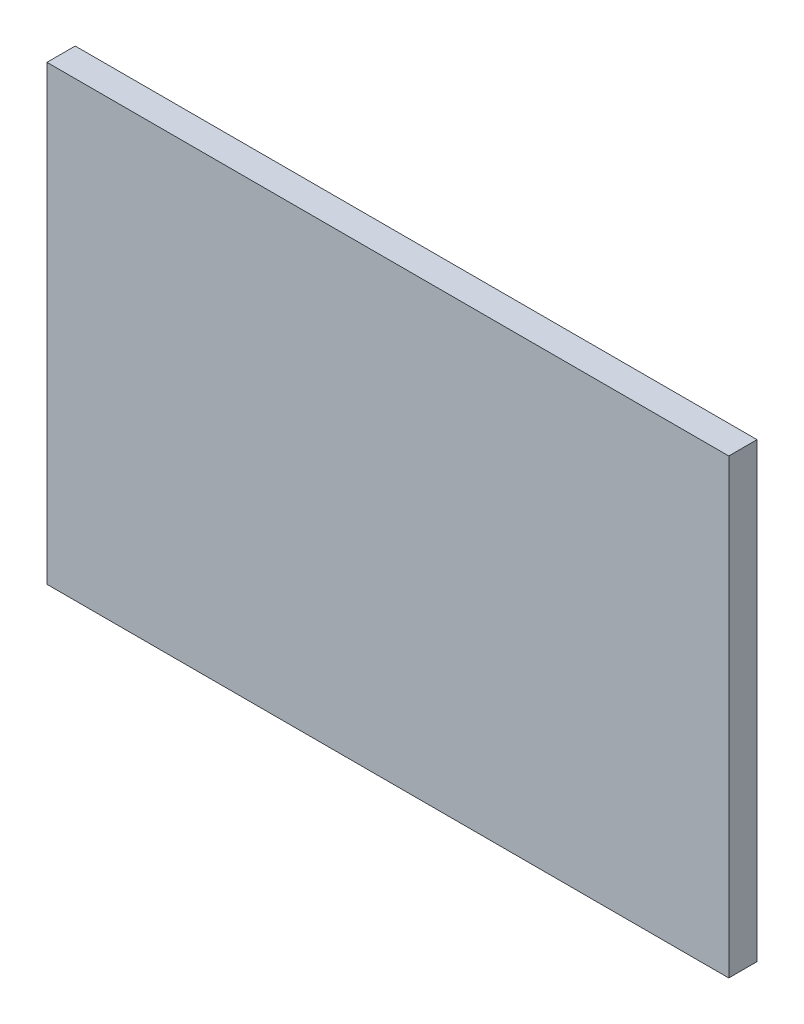
ISO-10303-21;
HEADER;
FILE_DESCRIPTION(('STEP AP214'),'2;1');
FILE_NAME('part.step','',(''),(''),'','','');
FILE_SCHEMA(('AUTOMOTIVE_DESIGN { 1 0 10303 214 1 1 1 1 }'));
ENDSEC;
DATA;
#1=APPLICATION_CONTEXT('core data for automotive mechanical design processes');
#2=APPLICATION_PROTOCOL_DEFINITION('international standard','automotive_design',2000,#1);
#3=PRODUCT_CONTEXT('',#1,'mechanical');
#4=PRODUCT('Part','Part','',(#3));
#5=PRODUCT_RELATED_PRODUCT_CATEGORY('part','',(#4));
#6=PRODUCT_DEFINITION_FORMATION('','',#4);
#7=PRODUCT_DEFINITION_CONTEXT('part definition',#1,'design');
#8=PRODUCT_DEFINITION('design','',#6,#7);
#9=PRODUCT_DEFINITION_SHAPE('','',#8);
#10=(LENGTH_UNIT() NAMED_UNIT(*) SI_UNIT(.MILLI.,.METRE.));
#11=(NAMED_UNIT(*) PLANE_ANGLE_UNIT() SI_UNIT($,.RADIAN.));
#12=(NAMED_UNIT(*) SI_UNIT($,.STERADIAN.) SOLID_ANGLE_UNIT());
#13=UNCERTAINTY_MEASURE_WITH_UNIT(LENGTH_MEASURE(1.E-05),#10,'distance_accuracy_value','');
#14=(GEOMETRIC_REPRESENTATION_CONTEXT(3) GLOBAL_UNCERTAINTY_ASSIGNED_CONTEXT((#13)) GLOBAL_UNIT_ASSIGNED_CONTEXT((#10,
#11,#12)) REPRESENTATION_CONTEXT('',''));
#15=CARTESIAN_POINT('',(0.,0.,0.));
#16=DIRECTION('',(0.,0.,1.));
#17=DIRECTION('',(1.,0.,0.));
#18=AXIS2_PLACEMENT_3D('',#15,#16,#17);
#19=CARTESIAN_POINT('',(12.0643777,-8.00047676,0.));
#20=DIRECTION('',(-0.999999998034197,6.27025131227524E-05,0.));
#21=DIRECTION('',(0.,0.,1.));
#22=AXIS2_PLACEMENT_3D('',#19,#20,#21);
#23=PLANE('',#22);
#24=DIRECTION('',(6.27025131227524E-05,0.999999998034197,0.));
#25=VECTOR('',#24,1.);
#26=CARTESIAN_POINT('',(12.0643777,-8.00047676,0.));
#27=LINE('',#26,#25);
#28=CARTESIAN_POINT('',(12.0643777,-8.00047676,0.));
#29=VERTEX_POINT('',#28);
#30=CARTESIAN_POINT('',(12.065381,8.00047676,0.));
#31=VERTEX_POINT('',#30);
#32=EDGE_CURVE('E11',#29,#31,#27,.T.);
#33=ORIENTED_EDGE('',*,*,#32,.T.);
#34=DIRECTION('',(0.,0.,1.));
#35=VECTOR('',#34,1.);
#36=CARTESIAN_POINT('',(12.065381,8.00047676,0.));
#37=LINE('',#36,#35);
#38=CARTESIAN_POINT('',(12.065381,8.00047676,1.00000054));
#39=VERTEX_POINT('',#38);
#40=EDGE_CURVE('E28',#31,#39,#37,.T.);
#41=ORIENTED_EDGE('',*,*,#40,.T.);
#42=DIRECTION('',(6.27025131227524E-05,0.999999998034197,0.));
#43=VECTOR('',#42,1.);
#44=CARTESIAN_POINT('',(12.0643777,-8.00047676,1.00000054));
#45=LINE('',#44,#43);
#46=CARTESIAN_POINT('',(12.0643777,-8.00047676,1.00000054));
#47=VERTEX_POINT('',#46);
#48=EDGE_CURVE('E81',#47,#39,#45,.T.);
#49=ORIENTED_EDGE('',*,*,#48,.F.);
#50=DIRECTION('',(0.,0.,1.));
#51=VECTOR('',#50,1.);
#52=CARTESIAN_POINT('',(12.0643777,-8.00047676,0.));
#53=LINE('',#52,#51);
#54=EDGE_CURVE('E85',#29,#47,#53,.T.);
#55=ORIENTED_EDGE('',*,*,#54,.F.);
#56=EDGE_LOOP('',(#33,#41,#49,#55));
#57=FACE_BOUND('',#56,.T.);
#58=ADVANCED_FACE('F17',(#57),#23,.F.);
#59=CARTESIAN_POINT('',(12.065381,8.00047676,0.));
#60=DIRECTION('',(0.,-1.,0.));
#61=DIRECTION('',(0.,0.,-1.));
#62=AXIS2_PLACEMENT_3D('',#59,#60,#61);
#63=PLANE('',#62);
#64=DIRECTION('',(-1.,0.,0.));
#65=VECTOR('',#64,1.);
#66=CARTESIAN_POINT('',(12.065381,8.00047676,0.));
#67=LINE('',#66,#65);
#68=CARTESIAN_POINT('',(-12.065381,8.00047676,0.));
#69=VERTEX_POINT('',#68);
#70=EDGE_CURVE('E95',#31,#69,#67,.T.);
#71=ORIENTED_EDGE('',*,*,#70,.T.);
#72=DIRECTION('',(0.,0.,1.));
#73=VECTOR('',#72,1.);
#74=CARTESIAN_POINT('',(-12.065381,8.00047676,0.));
#75=LINE('',#74,#73);
#76=CARTESIAN_POINT('',(-12.065381,8.00047676,1.00000054));
#77=VERTEX_POINT('',#76);
#78=EDGE_CURVE('E111',#69,#77,#75,.T.);
#79=ORIENTED_EDGE('',*,*,#78,.T.);
#80=DIRECTION('',(-1.,0.,0.));
#81=VECTOR('',#80,1.);
#82=CARTESIAN_POINT('',(12.065381,8.00047676,1.00000054));
#83=LINE('',#82,#81);
#84=EDGE_CURVE('E71',#39,#77,#83,.T.);
#85=ORIENTED_EDGE('',*,*,#84,.F.);
#86=ORIENTED_EDGE('',*,*,#40,.F.);
#87=EDGE_LOOP('',(#71,#79,#85,#86));
#88=FACE_BOUND('',#87,.T.);
#89=ADVANCED_FACE('F19',(#88),#63,.F.);
#90=CARTESIAN_POINT('',(-12.065381,8.00047676,0.));
#91=DIRECTION('',(1.,0.,0.));
#92=DIRECTION('',(0.,1.,0.));
#93=AXIS2_PLACEMENT_3D('',#90,#91,#92);
#94=PLANE('',#93);
#95=DIRECTION('',(0.,-1.,0.));
#96=VECTOR('',#95,1.);
#97=CARTESIAN_POINT('',(-12.065381,8.00047676,0.));
#98=LINE('',#97,#96);
#99=CARTESIAN_POINT('',(-12.065381,-7.9996157,0.));
#100=VERTEX_POINT('',#99);
#101=EDGE_CURVE('E21',#69,#100,#98,.T.);
#102=ORIENTED_EDGE('',*,*,#101,.T.);
#103=DIRECTION('',(0.,0.,1.));
#104=VECTOR('',#103,1.);
#105=CARTESIAN_POINT('',(-12.065381,-7.9996157,0.));
#106=LINE('',#105,#104);
#107=CARTESIAN_POINT('',(-12.065381,-7.9996157,1.00000054));
#108=VERTEX_POINT('',#107);
#109=EDGE_CURVE('E66',#100,#108,#106,.T.);
#110=ORIENTED_EDGE('',*,*,#109,.T.);
#111=DIRECTION('',(0.,-1.,0.));
#112=VECTOR('',#111,1.);
#113=CARTESIAN_POINT('',(-12.065381,8.00047676,1.00000054));
#114=LINE('',#113,#112);
#115=EDGE_CURVE('E57',#77,#108,#114,.T.);
#116=ORIENTED_EDGE('',*,*,#115,.F.);
#117=ORIENTED_EDGE('',*,*,#78,.F.);
#118=EDGE_LOOP('',(#102,#110,#116,#117));
#119=FACE_BOUND('',#118,.T.);
#120=ADVANCED_FACE('F141',(#119),#94,.F.);
#121=CARTESIAN_POINT('',(-12.065381,-7.9996157,0.));
#122=DIRECTION('',(3.56845673495109E-05,0.999999999363306,0.));
#123=DIRECTION('',(0.,0.,-1.));
#124=AXIS2_PLACEMENT_3D('',#121,#122,#123);
#125=PLANE('',#124);
#126=DIRECTION('',(0.999999999363306,-3.56845673495109E-05,0.));
#127=VECTOR('',#126,1.);
#128=CARTESIAN_POINT('',(-12.065381,-7.9996157,0.));
#129=LINE('',#128,#127);
#130=EDGE_CURVE('E89',#100,#29,#129,.T.);
#131=ORIENTED_EDGE('',*,*,#130,.T.);
#132=ORIENTED_EDGE('',*,*,#54,.T.);
#133=DIRECTION('',(0.999999999363306,-3.56845673495109E-05,0.));
#134=VECTOR('',#133,1.);
#135=CARTESIAN_POINT('',(-12.065381,-7.9996157,1.00000054));
#136=LINE('',#135,#134);
#137=EDGE_CURVE('E104',#108,#47,#136,.T.);
#138=ORIENTED_EDGE('',*,*,#137,.F.);
#139=ORIENTED_EDGE('',*,*,#109,.F.);
#140=EDGE_LOOP('',(#131,#132,#138,#139));
#141=FACE_BOUND('',#140,.T.);
#142=ADVANCED_FACE('F96',(#141),#125,.F.);
#143=CARTESIAN_POINT('',(12.0643777,-8.00047676,0.));
#144=DIRECTION('',(0.,0.,-1.));
#145=DIRECTION('',(0.,-1.,0.));
#146=AXIS2_PLACEMENT_3D('',#143,#144,#145);
#147=PLANE('',#146);
#148=ORIENTED_EDGE('',*,*,#130,.F.);
#149=ORIENTED_EDGE('',*,*,#101,.F.);
#150=ORIENTED_EDGE('',*,*,#70,.F.);
#151=ORIENTED_EDGE('',*,*,#32,.F.);
#152=EDGE_LOOP('',(#148,#149,#150,#151));
#153=FACE_BOUND('',#152,.T.);
#154=ADVANCED_FACE('F93',(#153),#147,.T.);
#155=CARTESIAN_POINT('',(12.0643777,-8.00047676,1.00000054));
#156=DIRECTION('',(0.,0.,-1.));
#157=DIRECTION('',(0.,-1.,0.));
#158=AXIS2_PLACEMENT_3D('',#155,#156,#157);
#159=PLANE('',#158);
#160=ORIENTED_EDGE('',*,*,#48,.T.);
#161=ORIENTED_EDGE('',*,*,#84,.T.);
#162=ORIENTED_EDGE('',*,*,#115,.T.);
#163=ORIENTED_EDGE('',*,*,#137,.T.);
#164=EDGE_LOOP('',(#160,#161,#162,#163));
#165=FACE_BOUND('',#164,.T.);
#166=ADVANCED_FACE('F127',(#165),#159,.F.);
#167=CLOSED_SHELL('',(#58,#89,#120,#142,#154,#166));
#168=MANIFOLD_SOLID_BREP('B1',#167);
#169=ADVANCED_BREP_SHAPE_REPRESENTATION('',(#18,#168),#14);
#170=SHAPE_DEFINITION_REPRESENTATION(#9,#169);
ENDSEC;
END-ISO-10303-21;
